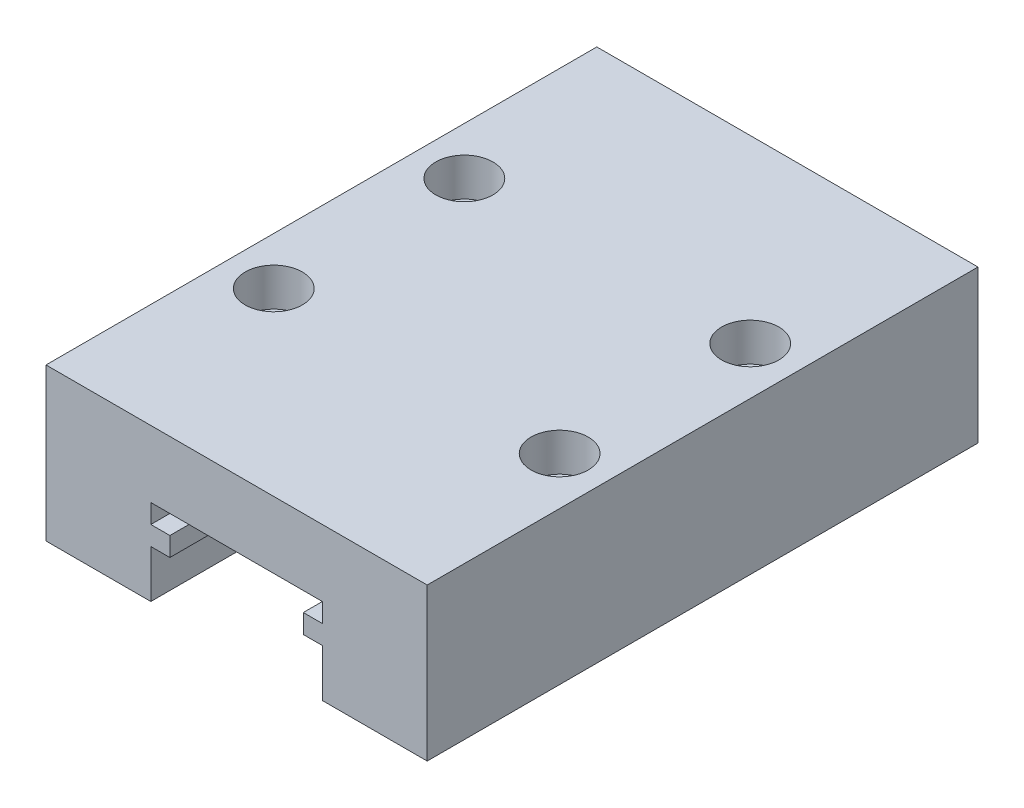
ISO-10303-21;
HEADER;
FILE_DESCRIPTION(('STEP AP214'),'2;1');
FILE_NAME('part.step','',(''),(''),'','','');
FILE_SCHEMA(('AUTOMOTIVE_DESIGN { 1 0 10303 214 1 1 1 1 }'));
ENDSEC;
DATA;
#1=APPLICATION_CONTEXT('core data for automotive mechanical design processes');
#2=APPLICATION_PROTOCOL_DEFINITION('international standard','automotive_design',2000,#1);
#3=PRODUCT_CONTEXT('',#1,'mechanical');
#4=PRODUCT('Part','Part','',(#3));
#5=PRODUCT_RELATED_PRODUCT_CATEGORY('part','',(#4));
#6=PRODUCT_DEFINITION_FORMATION('','',#4);
#7=PRODUCT_DEFINITION_CONTEXT('part definition',#1,'design');
#8=PRODUCT_DEFINITION('design','',#6,#7);
#9=PRODUCT_DEFINITION_SHAPE('','',#8);
#10=(LENGTH_UNIT() NAMED_UNIT(*) SI_UNIT(.MILLI.,.METRE.));
#11=(NAMED_UNIT(*) PLANE_ANGLE_UNIT() SI_UNIT($,.RADIAN.));
#12=(NAMED_UNIT(*) SI_UNIT($,.STERADIAN.) SOLID_ANGLE_UNIT());
#13=UNCERTAINTY_MEASURE_WITH_UNIT(LENGTH_MEASURE(1.E-05),#10,'distance_accuracy_value','');
#14=(GEOMETRIC_REPRESENTATION_CONTEXT(3) GLOBAL_UNCERTAINTY_ASSIGNED_CONTEXT((#13)) GLOBAL_UNIT_ASSIGNED_CONTEXT((#10,
#11,#12)) REPRESENTATION_CONTEXT('',''));
#15=CARTESIAN_POINT('',(0.,0.,0.));
#16=DIRECTION('',(0.,0.,1.));
#17=DIRECTION('',(1.,0.,0.));
#18=AXIS2_PLACEMENT_3D('',#15,#16,#17);
#19=CARTESIAN_POINT('',(-10.,8.,28.9));
#20=DIRECTION('',(1.,0.,0.));
#21=DIRECTION('',(0.,1.,0.));
#22=AXIS2_PLACEMENT_3D('',#19,#20,#21);
#23=PLANE('',#22);
#24=DIRECTION('',(0.,-1.,0.));
#25=VECTOR('',#24,1.);
#26=CARTESIAN_POINT('',(-10.,8.,0.));
#27=LINE('',#26,#25);
#28=CARTESIAN_POINT('',(-10.,8.,0.));
#29=VERTEX_POINT('',#28);
#30=CARTESIAN_POINT('',(-10.,0.,0.));
#31=VERTEX_POINT('',#30);
#32=EDGE_CURVE('E179',#29,#31,#27,.T.);
#33=ORIENTED_EDGE('',*,*,#32,.T.);
#34=DIRECTION('',(0.,0.,-1.));
#35=VECTOR('',#34,1.);
#36=CARTESIAN_POINT('',(-10.,0.,28.9));
#37=LINE('',#36,#35);
#38=CARTESIAN_POINT('',(-10.,0.,28.9));
#39=VERTEX_POINT('',#38);
#40=EDGE_CURVE('E11',#39,#31,#37,.T.);
#41=ORIENTED_EDGE('',*,*,#40,.F.);
#42=DIRECTION('',(0.,-1.,0.));
#43=VECTOR('',#42,1.);
#44=CARTESIAN_POINT('',(-10.,8.,28.9));
#45=LINE('',#44,#43);
#46=CARTESIAN_POINT('',(-10.,8.,28.9));
#47=VERTEX_POINT('',#46);
#48=EDGE_CURVE('E210',#47,#39,#45,.T.);
#49=ORIENTED_EDGE('',*,*,#48,.F.);
#50=DIRECTION('',(0.,0.,-1.));
#51=VECTOR('',#50,1.);
#52=CARTESIAN_POINT('',(-10.,8.,28.9));
#53=LINE('',#52,#51);
#54=EDGE_CURVE('E175',#47,#29,#53,.T.);
#55=ORIENTED_EDGE('',*,*,#54,.T.);
#56=EDGE_LOOP('',(#33,#41,#49,#55));
#57=FACE_BOUND('',#56,.T.);
#58=ADVANCED_FACE('F35',(#57),#23,.F.);
#59=CARTESIAN_POINT('',(-10.,0.,28.9));
#60=DIRECTION('',(0.,1.,0.));
#61=DIRECTION('',(0.,0.,1.));
#62=AXIS2_PLACEMENT_3D('',#59,#60,#61);
#63=PLANE('',#62);
#64=DIRECTION('',(1.,0.,0.));
#65=VECTOR('',#64,1.);
#66=CARTESIAN_POINT('',(-10.,0.,0.));
#67=LINE('',#66,#65);
#68=CARTESIAN_POINT('',(-4.5,0.,0.));
#69=VERTEX_POINT('',#68);
#70=EDGE_CURVE('E182',#31,#69,#67,.T.);
#71=ORIENTED_EDGE('',*,*,#70,.T.);
#72=DIRECTION('',(0.,0.,-1.));
#73=VECTOR('',#72,1.);
#74=CARTESIAN_POINT('',(-4.5,0.,28.9));
#75=LINE('',#74,#73);
#76=CARTESIAN_POINT('',(-4.5,0.,28.9));
#77=VERTEX_POINT('',#76);
#78=EDGE_CURVE('E43',#77,#69,#75,.T.);
#79=ORIENTED_EDGE('',*,*,#78,.F.);
#80=DIRECTION('',(1.,0.,0.));
#81=VECTOR('',#80,1.);
#82=CARTESIAN_POINT('',(-10.,0.,28.9));
#83=LINE('',#82,#81);
#84=EDGE_CURVE('E118',#39,#77,#83,.T.);
#85=ORIENTED_EDGE('',*,*,#84,.F.);
#86=ORIENTED_EDGE('',*,*,#40,.T.);
#87=EDGE_LOOP('',(#71,#79,#85,#86));
#88=FACE_BOUND('',#87,.T.);
#89=ADVANCED_FACE('F311',(#88),#63,.F.);
#90=CARTESIAN_POINT('',(-4.5,2.5,28.9));
#91=DIRECTION('',(-1.,0.,0.));
#92=DIRECTION('',(0.,0.,1.));
#93=AXIS2_PLACEMENT_3D('',#90,#91,#92);
#94=PLANE('',#93);
#95=DIRECTION('',(0.,1.,0.));
#96=VECTOR('',#95,1.);
#97=CARTESIAN_POINT('',(-4.5,2.5,0.));
#98=LINE('',#97,#96);
#99=CARTESIAN_POINT('',(-4.5,2.5,0.));
#100=VERTEX_POINT('',#99);
#101=EDGE_CURVE('E185',#69,#100,#98,.T.);
#102=ORIENTED_EDGE('',*,*,#101,.T.);
#103=DIRECTION('',(0.,0.,-1.));
#104=VECTOR('',#103,1.);
#105=CARTESIAN_POINT('',(-4.5,2.5,28.9));
#106=LINE('',#105,#104);
#107=CARTESIAN_POINT('',(-4.5,2.5,28.9));
#108=VERTEX_POINT('',#107);
#109=EDGE_CURVE('E241',#108,#100,#106,.T.);
#110=ORIENTED_EDGE('',*,*,#109,.F.);
#111=DIRECTION('',(0.,1.,0.));
#112=VECTOR('',#111,1.);
#113=CARTESIAN_POINT('',(-4.5,2.5,28.9));
#114=LINE('',#113,#112);
#115=EDGE_CURVE('E249',#77,#108,#114,.T.);
#116=ORIENTED_EDGE('',*,*,#115,.F.);
#117=ORIENTED_EDGE('',*,*,#78,.T.);
#118=EDGE_LOOP('',(#102,#110,#116,#117));
#119=FACE_BOUND('',#118,.T.);
#120=ADVANCED_FACE('F247',(#119),#94,.F.);
#121=CARTESIAN_POINT('',(-3.5,2.5,28.9));
#122=DIRECTION('',(0.,1.,0.));
#123=DIRECTION('',(-1.,0.,0.));
#124=AXIS2_PLACEMENT_3D('',#121,#122,#123);
#125=PLANE('',#124);
#126=DIRECTION('',(1.,0.,0.));
#127=VECTOR('',#126,1.);
#128=CARTESIAN_POINT('',(-3.5,2.5,0.));
#129=LINE('',#128,#127);
#130=CARTESIAN_POINT('',(-3.5,2.5,0.));
#131=VERTEX_POINT('',#130);
#132=EDGE_CURVE('E187',#100,#131,#129,.T.);
#133=ORIENTED_EDGE('',*,*,#132,.T.);
#134=DIRECTION('',(0.,0.,-1.));
#135=VECTOR('',#134,1.);
#136=CARTESIAN_POINT('',(-3.5,2.5,28.9));
#137=LINE('',#136,#135);
#138=CARTESIAN_POINT('',(-3.5,2.5,28.9));
#139=VERTEX_POINT('',#138);
#140=EDGE_CURVE('E238',#139,#131,#137,.T.);
#141=ORIENTED_EDGE('',*,*,#140,.F.);
#142=DIRECTION('',(1.,0.,0.));
#143=VECTOR('',#142,1.);
#144=CARTESIAN_POINT('',(-3.5,2.5,28.9));
#145=LINE('',#144,#143);
#146=EDGE_CURVE('E267',#108,#139,#145,.T.);
#147=ORIENTED_EDGE('',*,*,#146,.F.);
#148=ORIENTED_EDGE('',*,*,#109,.T.);
#149=EDGE_LOOP('',(#133,#141,#147,#148));
#150=FACE_BOUND('',#149,.T.);
#151=ADVANCED_FACE('F258',(#150),#125,.F.);
#152=CARTESIAN_POINT('',(-3.5,3.5,28.9));
#153=DIRECTION('',(-1.,0.,0.));
#154=DIRECTION('',(0.,-1.,0.));
#155=AXIS2_PLACEMENT_3D('',#152,#153,#154);
#156=PLANE('',#155);
#157=DIRECTION('',(0.,1.,0.));
#158=VECTOR('',#157,1.);
#159=CARTESIAN_POINT('',(-3.5,3.5,0.));
#160=LINE('',#159,#158);
#161=CARTESIAN_POINT('',(-3.5,3.5,0.));
#162=VERTEX_POINT('',#161);
#163=EDGE_CURVE('E189',#131,#162,#160,.T.);
#164=ORIENTED_EDGE('',*,*,#163,.T.);
#165=DIRECTION('',(0.,0.,-1.));
#166=VECTOR('',#165,1.);
#167=CARTESIAN_POINT('',(-3.5,3.5,28.9));
#168=LINE('',#167,#166);
#169=CARTESIAN_POINT('',(-3.5,3.5,28.9));
#170=VERTEX_POINT('',#169);
#171=EDGE_CURVE('E235',#170,#162,#168,.T.);
#172=ORIENTED_EDGE('',*,*,#171,.F.);
#173=DIRECTION('',(0.,1.,0.));
#174=VECTOR('',#173,1.);
#175=CARTESIAN_POINT('',(-3.5,3.5,28.9));
#176=LINE('',#175,#174);
#177=EDGE_CURVE('E264',#139,#170,#176,.T.);
#178=ORIENTED_EDGE('',*,*,#177,.F.);
#179=ORIENTED_EDGE('',*,*,#140,.T.);
#180=EDGE_LOOP('',(#164,#172,#178,#179));
#181=FACE_BOUND('',#180,.T.);
#182=ADVANCED_FACE('F262',(#181),#156,.F.);
#183=CARTESIAN_POINT('',(-4.5,3.5,28.9));
#184=DIRECTION('',(0.,-1.,0.));
#185=DIRECTION('',(0.,0.,-1.));
#186=AXIS2_PLACEMENT_3D('',#183,#184,#185);
#187=PLANE('',#186);
#188=DIRECTION('',(-1.,0.,0.));
#189=VECTOR('',#188,1.);
#190=CARTESIAN_POINT('',(-4.5,3.5,0.));
#191=LINE('',#190,#189);
#192=CARTESIAN_POINT('',(-4.5,3.5,0.));
#193=VERTEX_POINT('',#192);
#194=EDGE_CURVE('E191',#162,#193,#191,.T.);
#195=ORIENTED_EDGE('',*,*,#194,.T.);
#196=DIRECTION('',(0.,0.,-1.));
#197=VECTOR('',#196,1.);
#198=CARTESIAN_POINT('',(-4.5,3.5,28.9));
#199=LINE('',#198,#197);
#200=CARTESIAN_POINT('',(-4.5,3.5,28.9));
#201=VERTEX_POINT('',#200);
#202=EDGE_CURVE('E232',#201,#193,#199,.T.);
#203=ORIENTED_EDGE('',*,*,#202,.F.);
#204=DIRECTION('',(-1.,0.,0.));
#205=VECTOR('',#204,1.);
#206=CARTESIAN_POINT('',(-4.5,3.5,28.9));
#207=LINE('',#206,#205);
#208=EDGE_CURVE('E266',#170,#201,#207,.T.);
#209=ORIENTED_EDGE('',*,*,#208,.F.);
#210=ORIENTED_EDGE('',*,*,#171,.T.);
#211=EDGE_LOOP('',(#195,#203,#209,#210));
#212=FACE_BOUND('',#211,.T.);
#213=ADVANCED_FACE('F324',(#212),#187,.F.);
#214=CARTESIAN_POINT('',(-4.5,4.5,28.9));
#215=DIRECTION('',(-1.,0.,0.));
#216=DIRECTION('',(0.,0.,1.));
#217=AXIS2_PLACEMENT_3D('',#214,#215,#216);
#218=PLANE('',#217);
#219=DIRECTION('',(0.,1.,0.));
#220=VECTOR('',#219,1.);
#221=CARTESIAN_POINT('',(-4.5,4.5,0.));
#222=LINE('',#221,#220);
#223=CARTESIAN_POINT('',(-4.5,4.5,0.));
#224=VERTEX_POINT('',#223);
#225=EDGE_CURVE('E193',#193,#224,#222,.T.);
#226=ORIENTED_EDGE('',*,*,#225,.T.);
#227=DIRECTION('',(0.,0.,-1.));
#228=VECTOR('',#227,1.);
#229=CARTESIAN_POINT('',(-4.5,4.5,28.9));
#230=LINE('',#229,#228);
#231=CARTESIAN_POINT('',(-4.5,4.5,28.9));
#232=VERTEX_POINT('',#231);
#233=EDGE_CURVE('E229',#232,#224,#230,.T.);
#234=ORIENTED_EDGE('',*,*,#233,.F.);
#235=DIRECTION('',(0.,1.,0.));
#236=VECTOR('',#235,1.);
#237=CARTESIAN_POINT('',(-4.5,4.5,28.9));
#238=LINE('',#237,#236);
#239=EDGE_CURVE('E269',#201,#232,#238,.T.);
#240=ORIENTED_EDGE('',*,*,#239,.F.);
#241=ORIENTED_EDGE('',*,*,#202,.T.);
#242=EDGE_LOOP('',(#226,#234,#240,#241));
#243=FACE_BOUND('',#242,.T.);
#244=ADVANCED_FACE('F327',(#243),#218,.F.);
#245=CARTESIAN_POINT('',(-4.5,4.5,28.9));
#246=DIRECTION('',(0.,1.,0.));
#247=DIRECTION('',(0.,0.,1.));
#248=AXIS2_PLACEMENT_3D('',#245,#246,#247);
#249=PLANE('',#248);
#250=DIRECTION('',(1.,0.,0.));
#251=VECTOR('',#250,1.);
#252=CARTESIAN_POINT('',(-4.5,4.5,0.));
#253=LINE('',#252,#251);
#254=CARTESIAN_POINT('',(4.5,4.5,0.));
#255=VERTEX_POINT('',#254);
#256=EDGE_CURVE('E195',#224,#255,#253,.T.);
#257=ORIENTED_EDGE('',*,*,#256,.T.);
#258=DIRECTION('',(0.,0.,-1.));
#259=VECTOR('',#258,1.);
#260=CARTESIAN_POINT('',(4.5,4.5,28.9));
#261=LINE('',#260,#259);
#262=CARTESIAN_POINT('',(4.5,4.5,28.9));
#263=VERTEX_POINT('',#262);
#264=EDGE_CURVE('E226',#263,#255,#261,.T.);
#265=ORIENTED_EDGE('',*,*,#264,.F.);
#266=DIRECTION('',(1.,0.,0.));
#267=VECTOR('',#266,1.);
#268=CARTESIAN_POINT('',(-4.5,4.5,28.9));
#269=LINE('',#268,#267);
#270=EDGE_CURVE('E275',#232,#263,#269,.T.);
#271=ORIENTED_EDGE('',*,*,#270,.F.);
#272=ORIENTED_EDGE('',*,*,#233,.T.);
#273=EDGE_LOOP('',(#257,#265,#271,#272));
#274=FACE_BOUND('',#273,.T.);
#275=ADVANCED_FACE('F331',(#274),#249,.F.);
#276=CARTESIAN_POINT('',(4.5,3.5,28.9));
#277=DIRECTION('',(1.,0.,0.));
#278=DIRECTION('',(0.,1.,0.));
#279=AXIS2_PLACEMENT_3D('',#276,#277,#278);
#280=PLANE('',#279);
#281=DIRECTION('',(0.,-1.,0.));
#282=VECTOR('',#281,1.);
#283=CARTESIAN_POINT('',(4.5,3.5,0.));
#284=LINE('',#283,#282);
#285=CARTESIAN_POINT('',(4.5,3.5,0.));
#286=VERTEX_POINT('',#285);
#287=EDGE_CURVE('E197',#255,#286,#284,.T.);
#288=ORIENTED_EDGE('',*,*,#287,.T.);
#289=DIRECTION('',(0.,0.,-1.));
#290=VECTOR('',#289,1.);
#291=CARTESIAN_POINT('',(4.5,3.5,28.9));
#292=LINE('',#291,#290);
#293=CARTESIAN_POINT('',(4.5,3.5,28.9));
#294=VERTEX_POINT('',#293);
#295=EDGE_CURVE('E223',#294,#286,#292,.T.);
#296=ORIENTED_EDGE('',*,*,#295,.F.);
#297=DIRECTION('',(0.,-1.,0.));
#298=VECTOR('',#297,1.);
#299=CARTESIAN_POINT('',(4.5,3.5,28.9));
#300=LINE('',#299,#298);
#301=EDGE_CURVE('E277',#263,#294,#300,.T.);
#302=ORIENTED_EDGE('',*,*,#301,.F.);
#303=ORIENTED_EDGE('',*,*,#264,.T.);
#304=EDGE_LOOP('',(#288,#296,#302,#303));
#305=FACE_BOUND('',#304,.T.);
#306=ADVANCED_FACE('F335',(#305),#280,.F.);
#307=CARTESIAN_POINT('',(4.5,3.5,28.9));
#308=DIRECTION('',(0.,-1.,0.));
#309=DIRECTION('',(1.,0.,0.));
#310=AXIS2_PLACEMENT_3D('',#307,#308,#309);
#311=PLANE('',#310);
#312=DIRECTION('',(-1.,0.,0.));
#313=VECTOR('',#312,1.);
#314=CARTESIAN_POINT('',(4.5,3.5,0.));
#315=LINE('',#314,#313);
#316=CARTESIAN_POINT('',(3.5,3.5,0.));
#317=VERTEX_POINT('',#316);
#318=EDGE_CURVE('E199',#286,#317,#315,.T.);
#319=ORIENTED_EDGE('',*,*,#318,.T.);
#320=DIRECTION('',(0.,0.,-1.));
#321=VECTOR('',#320,1.);
#322=CARTESIAN_POINT('',(3.5,3.5,28.9));
#323=LINE('',#322,#321);
#324=CARTESIAN_POINT('',(3.5,3.5,28.9));
#325=VERTEX_POINT('',#324);
#326=EDGE_CURVE('E220',#325,#317,#323,.T.);
#327=ORIENTED_EDGE('',*,*,#326,.F.);
#328=DIRECTION('',(-1.,0.,0.));
#329=VECTOR('',#328,1.);
#330=CARTESIAN_POINT('',(4.5,3.5,28.9));
#331=LINE('',#330,#329);
#332=EDGE_CURVE('E279',#294,#325,#331,.T.);
#333=ORIENTED_EDGE('',*,*,#332,.F.);
#334=ORIENTED_EDGE('',*,*,#295,.T.);
#335=EDGE_LOOP('',(#319,#327,#333,#334));
#336=FACE_BOUND('',#335,.T.);
#337=ADVANCED_FACE('F339',(#336),#311,.F.);
#338=CARTESIAN_POINT('',(3.5,3.5,28.9));
#339=DIRECTION('',(1.,0.,0.));
#340=DIRECTION('',(0.,0.,-1.));
#341=AXIS2_PLACEMENT_3D('',#338,#339,#340);
#342=PLANE('',#341);
#343=DIRECTION('',(0.,-1.,0.));
#344=VECTOR('',#343,1.);
#345=CARTESIAN_POINT('',(3.5,3.5,0.));
#346=LINE('',#345,#344);
#347=CARTESIAN_POINT('',(3.5,2.5,0.));
#348=VERTEX_POINT('',#347);
#349=EDGE_CURVE('E201',#317,#348,#346,.T.);
#350=ORIENTED_EDGE('',*,*,#349,.T.);
#351=DIRECTION('',(0.,0.,-1.));
#352=VECTOR('',#351,1.);
#353=CARTESIAN_POINT('',(3.5,2.5,28.9));
#354=LINE('',#353,#352);
#355=CARTESIAN_POINT('',(3.5,2.5,28.9));
#356=VERTEX_POINT('',#355);
#357=EDGE_CURVE('E217',#356,#348,#354,.T.);
#358=ORIENTED_EDGE('',*,*,#357,.F.);
#359=DIRECTION('',(0.,-1.,0.));
#360=VECTOR('',#359,1.);
#361=CARTESIAN_POINT('',(3.5,3.5,28.9));
#362=LINE('',#361,#360);
#363=EDGE_CURVE('E281',#325,#356,#362,.T.);
#364=ORIENTED_EDGE('',*,*,#363,.F.);
#365=ORIENTED_EDGE('',*,*,#326,.T.);
#366=EDGE_LOOP('',(#350,#358,#364,#365));
#367=FACE_BOUND('',#366,.T.);
#368=ADVANCED_FACE('F343',(#367),#342,.F.);
#369=CARTESIAN_POINT('',(3.5,2.5,28.9));
#370=DIRECTION('',(0.,1.,0.));
#371=DIRECTION('',(0.,0.,1.));
#372=AXIS2_PLACEMENT_3D('',#369,#370,#371);
#373=PLANE('',#372);
#374=DIRECTION('',(1.,0.,0.));
#375=VECTOR('',#374,1.);
#376=CARTESIAN_POINT('',(3.5,2.5,0.));
#377=LINE('',#376,#375);
#378=CARTESIAN_POINT('',(4.5,2.5,0.));
#379=VERTEX_POINT('',#378);
#380=EDGE_CURVE('E203',#348,#379,#377,.T.);
#381=ORIENTED_EDGE('',*,*,#380,.T.);
#382=DIRECTION('',(0.,0.,-1.));
#383=VECTOR('',#382,1.);
#384=CARTESIAN_POINT('',(4.5,2.5,28.9));
#385=LINE('',#384,#383);
#386=CARTESIAN_POINT('',(4.5,2.5,28.9));
#387=VERTEX_POINT('',#386);
#388=EDGE_CURVE('E214',#387,#379,#385,.T.);
#389=ORIENTED_EDGE('',*,*,#388,.F.);
#390=DIRECTION('',(1.,0.,0.));
#391=VECTOR('',#390,1.);
#392=CARTESIAN_POINT('',(3.5,2.5,28.9));
#393=LINE('',#392,#391);
#394=EDGE_CURVE('E283',#356,#387,#393,.T.);
#395=ORIENTED_EDGE('',*,*,#394,.F.);
#396=ORIENTED_EDGE('',*,*,#357,.T.);
#397=EDGE_LOOP('',(#381,#389,#395,#396));
#398=FACE_BOUND('',#397,.T.);
#399=ADVANCED_FACE('F289',(#398),#373,.F.);
#400=CARTESIAN_POINT('',(4.5,2.5,28.9));
#401=DIRECTION('',(1.,0.,0.));
#402=DIRECTION('',(0.,0.,-1.));
#403=AXIS2_PLACEMENT_3D('',#400,#401,#402);
#404=PLANE('',#403);
#405=DIRECTION('',(0.,-1.,0.));
#406=VECTOR('',#405,1.);
#407=CARTESIAN_POINT('',(4.5,2.5,0.));
#408=LINE('',#407,#406);
#409=CARTESIAN_POINT('',(4.5,0.,0.));
#410=VERTEX_POINT('',#409);
#411=EDGE_CURVE('E205',#379,#410,#408,.T.);
#412=ORIENTED_EDGE('',*,*,#411,.T.);
#413=DIRECTION('',(0.,0.,-1.));
#414=VECTOR('',#413,1.);
#415=CARTESIAN_POINT('',(4.5,0.,28.9));
#416=LINE('',#415,#414);
#417=CARTESIAN_POINT('',(4.5,0.,28.9));
#418=VERTEX_POINT('',#417);
#419=EDGE_CURVE('E170',#418,#410,#416,.T.);
#420=ORIENTED_EDGE('',*,*,#419,.F.);
#421=DIRECTION('',(0.,-1.,0.));
#422=VECTOR('',#421,1.);
#423=CARTESIAN_POINT('',(4.5,2.5,28.9));
#424=LINE('',#423,#422);
#425=EDGE_CURVE('E161',#387,#418,#424,.T.);
#426=ORIENTED_EDGE('',*,*,#425,.F.);
#427=ORIENTED_EDGE('',*,*,#388,.T.);
#428=EDGE_LOOP('',(#412,#420,#426,#427));
#429=FACE_BOUND('',#428,.T.);
#430=ADVANCED_FACE('F293',(#429),#404,.F.);
#431=CARTESIAN_POINT('',(10.,0.,28.9));
#432=DIRECTION('',(0.,1.,0.));
#433=DIRECTION('',(0.,0.,1.));
#434=AXIS2_PLACEMENT_3D('',#431,#432,#433);
#435=PLANE('',#434);
#436=DIRECTION('',(1.,0.,0.));
#437=VECTOR('',#436,1.);
#438=CARTESIAN_POINT('',(10.,0.,0.));
#439=LINE('',#438,#437);
#440=CARTESIAN_POINT('',(10.,0.,0.));
#441=VERTEX_POINT('',#440);
#442=EDGE_CURVE('E169',#410,#441,#439,.T.);
#443=ORIENTED_EDGE('',*,*,#442,.T.);
#444=DIRECTION('',(0.,0.,-1.));
#445=VECTOR('',#444,1.);
#446=CARTESIAN_POINT('',(10.,0.,28.9));
#447=LINE('',#446,#445);
#448=CARTESIAN_POINT('',(10.,0.,28.9));
#449=VERTEX_POINT('',#448);
#450=EDGE_CURVE('E166',#449,#441,#447,.T.);
#451=ORIENTED_EDGE('',*,*,#450,.F.);
#452=DIRECTION('',(1.,0.,0.));
#453=VECTOR('',#452,1.);
#454=CARTESIAN_POINT('',(10.,0.,28.9));
#455=LINE('',#454,#453);
#456=EDGE_CURVE('E155',#418,#449,#455,.T.);
#457=ORIENTED_EDGE('',*,*,#456,.F.);
#458=ORIENTED_EDGE('',*,*,#419,.T.);
#459=EDGE_LOOP('',(#443,#451,#457,#458));
#460=FACE_BOUND('',#459,.T.);
#461=ADVANCED_FACE('F167',(#460),#435,.F.);
#462=CARTESIAN_POINT('',(10.,8.,28.9));
#463=DIRECTION('',(-1.,0.,0.));
#464=DIRECTION('',(0.,-1.,0.));
#465=AXIS2_PLACEMENT_3D('',#462,#463,#464);
#466=PLANE('',#465);
#467=DIRECTION('',(0.,1.,0.));
#468=VECTOR('',#467,1.);
#469=CARTESIAN_POINT('',(10.,8.,0.));
#470=LINE('',#469,#468);
#471=CARTESIAN_POINT('',(10.,8.,0.));
#472=VERTEX_POINT('',#471);
#473=EDGE_CURVE('E104',#441,#472,#470,.T.);
#474=ORIENTED_EDGE('',*,*,#473,.T.);
#475=DIRECTION('',(0.,0.,-1.));
#476=VECTOR('',#475,1.);
#477=CARTESIAN_POINT('',(10.,8.,28.9));
#478=LINE('',#477,#476);
#479=CARTESIAN_POINT('',(10.,8.,28.9));
#480=VERTEX_POINT('',#479);
#481=EDGE_CURVE('E171',#480,#472,#478,.T.);
#482=ORIENTED_EDGE('',*,*,#481,.F.);
#483=DIRECTION('',(0.,1.,0.));
#484=VECTOR('',#483,1.);
#485=CARTESIAN_POINT('',(10.,8.,28.9));
#486=LINE('',#485,#484);
#487=EDGE_CURVE('E159',#449,#480,#486,.T.);
#488=ORIENTED_EDGE('',*,*,#487,.F.);
#489=ORIENTED_EDGE('',*,*,#450,.T.);
#490=EDGE_LOOP('',(#474,#482,#488,#489));
#491=FACE_BOUND('',#490,.T.);
#492=ADVANCED_FACE('F173',(#491),#466,.F.);
#493=CARTESIAN_POINT('',(10.,8.,28.9));
#494=DIRECTION('',(0.,-1.,0.));
#495=DIRECTION('',(1.,0.,0.));
#496=AXIS2_PLACEMENT_3D('',#493,#494,#495);
#497=PLANE('',#496);
#498=CARTESIAN_POINT('',(7.5,8.,9.45));
#499=DIRECTION('',(0.,1.,0.));
#500=DIRECTION('',(0.,0.,-1.));
#501=AXIS2_PLACEMENT_3D('',#498,#499,#500);
#502=CIRCLE('',#501,1.5);
#503=CARTESIAN_POINT('',(7.5,8.,7.95));
#504=VERTEX_POINT('',#503);
#505=EDGE_CURVE('E466',#504,#504,#502,.T.);
#506=ORIENTED_EDGE('',*,*,#505,.F.);
#507=EDGE_LOOP('',(#506));
#508=FACE_BOUND('',#507,.T.);
#509=CARTESIAN_POINT('',(7.5,8.,19.45));
#510=DIRECTION('',(0.,1.,0.));
#511=DIRECTION('',(0.,0.,-1.));
#512=AXIS2_PLACEMENT_3D('',#509,#510,#511);
#513=CIRCLE('',#512,1.5);
#514=CARTESIAN_POINT('',(7.5,8.,17.95));
#515=VERTEX_POINT('',#514);
#516=EDGE_CURVE('E465',#515,#515,#513,.T.);
#517=ORIENTED_EDGE('',*,*,#516,.F.);
#518=EDGE_LOOP('',(#517));
#519=FACE_BOUND('',#518,.T.);
#520=CARTESIAN_POINT('',(-7.5,8.,19.45));
#521=DIRECTION('',(0.,1.,0.));
#522=DIRECTION('',(0.,0.,1.));
#523=AXIS2_PLACEMENT_3D('',#520,#521,#522);
#524=CIRCLE('',#523,1.5);
#525=CARTESIAN_POINT('',(-7.5,8.,20.95));
#526=VERTEX_POINT('',#525);
#527=EDGE_CURVE('E485',#526,#526,#524,.T.);
#528=ORIENTED_EDGE('',*,*,#527,.F.);
#529=EDGE_LOOP('',(#528));
#530=FACE_BOUND('',#529,.T.);
#531=CARTESIAN_POINT('',(-7.5,8.,9.45));
#532=DIRECTION('',(0.,1.,0.));
#533=DIRECTION('',(0.,0.,1.));
#534=AXIS2_PLACEMENT_3D('',#531,#532,#533);
#535=CIRCLE('',#534,1.5);
#536=CARTESIAN_POINT('',(-7.5,8.,10.95));
#537=VERTEX_POINT('',#536);
#538=EDGE_CURVE('E477',#537,#537,#535,.T.);
#539=ORIENTED_EDGE('',*,*,#538,.F.);
#540=EDGE_LOOP('',(#539));
#541=FACE_BOUND('',#540,.T.);
#542=DIRECTION('',(-1.,0.,0.));
#543=VECTOR('',#542,1.);
#544=CARTESIAN_POINT('',(10.,8.,0.));
#545=LINE('',#544,#543);
#546=EDGE_CURVE('E110',#472,#29,#545,.T.);
#547=ORIENTED_EDGE('',*,*,#546,.T.);
#548=ORIENTED_EDGE('',*,*,#54,.F.);
#549=DIRECTION('',(-1.,0.,0.));
#550=VECTOR('',#549,1.);
#551=CARTESIAN_POINT('',(10.,8.,28.9));
#552=LINE('',#551,#550);
#553=EDGE_CURVE('E51',#480,#47,#552,.T.);
#554=ORIENTED_EDGE('',*,*,#553,.F.);
#555=ORIENTED_EDGE('',*,*,#481,.T.);
#556=EDGE_LOOP('',(#547,#548,#554,#555));
#557=FACE_BOUND('',#556,.T.);
#558=ADVANCED_FACE('F297',(#508,#519,#530,#541,#557),#497,.F.);
#559=CARTESIAN_POINT('',(0.,0.,28.9));
#560=DIRECTION('',(0.,0.,1.));
#561=DIRECTION('',(1.,0.,0.));
#562=AXIS2_PLACEMENT_3D('',#559,#560,#561);
#563=PLANE('',#562);
#564=ORIENTED_EDGE('',*,*,#48,.T.);
#565=ORIENTED_EDGE('',*,*,#84,.T.);
#566=ORIENTED_EDGE('',*,*,#115,.T.);
#567=ORIENTED_EDGE('',*,*,#146,.T.);
#568=ORIENTED_EDGE('',*,*,#177,.T.);
#569=ORIENTED_EDGE('',*,*,#208,.T.);
#570=ORIENTED_EDGE('',*,*,#239,.T.);
#571=ORIENTED_EDGE('',*,*,#270,.T.);
#572=ORIENTED_EDGE('',*,*,#301,.T.);
#573=ORIENTED_EDGE('',*,*,#332,.T.);
#574=ORIENTED_EDGE('',*,*,#363,.T.);
#575=ORIENTED_EDGE('',*,*,#394,.T.);
#576=ORIENTED_EDGE('',*,*,#425,.T.);
#577=ORIENTED_EDGE('',*,*,#456,.T.);
#578=ORIENTED_EDGE('',*,*,#487,.T.);
#579=ORIENTED_EDGE('',*,*,#553,.T.);
#580=EDGE_LOOP('',(#564,#565,#566,#567,#568,#569,#570,#571,#572,#573,#574,#575,#576,#577,#578,#579));
#581=FACE_BOUND('',#580,.T.);
#582=ADVANCED_FACE('F157',(#581),#563,.T.);
#583=CARTESIAN_POINT('',(0.,0.,0.));
#584=DIRECTION('',(0.,0.,1.));
#585=DIRECTION('',(1.,0.,0.));
#586=AXIS2_PLACEMENT_3D('',#583,#584,#585);
#587=PLANE('',#586);
#588=ORIENTED_EDGE('',*,*,#32,.F.);
#589=ORIENTED_EDGE('',*,*,#546,.F.);
#590=ORIENTED_EDGE('',*,*,#473,.F.);
#591=ORIENTED_EDGE('',*,*,#442,.F.);
#592=ORIENTED_EDGE('',*,*,#411,.F.);
#593=ORIENTED_EDGE('',*,*,#380,.F.);
#594=ORIENTED_EDGE('',*,*,#349,.F.);
#595=ORIENTED_EDGE('',*,*,#318,.F.);
#596=ORIENTED_EDGE('',*,*,#287,.F.);
#597=ORIENTED_EDGE('',*,*,#256,.F.);
#598=ORIENTED_EDGE('',*,*,#225,.F.);
#599=ORIENTED_EDGE('',*,*,#194,.F.);
#600=ORIENTED_EDGE('',*,*,#163,.F.);
#601=ORIENTED_EDGE('',*,*,#132,.F.);
#602=ORIENTED_EDGE('',*,*,#101,.F.);
#603=ORIENTED_EDGE('',*,*,#70,.F.);
#604=EDGE_LOOP('',(#588,#589,#590,#591,#592,#593,#594,#595,#596,#597,#598,#599,#600,#601,#602,#603));
#605=FACE_BOUND('',#604,.T.);
#606=ADVANCED_FACE('F253',(#605),#587,.F.);
#607=CARTESIAN_POINT('',(-7.5,6.,9.45));
#608=DIRECTION('',(0.,1.,0.));
#609=DIRECTION('',(0.,0.,1.));
#610=AXIS2_PLACEMENT_3D('',#607,#608,#609);
#611=CYLINDRICAL_SURFACE('',#610,1.5);
#612=CARTESIAN_POINT('',(-7.5,6.,9.45));
#613=DIRECTION('',(0.,1.,0.));
#614=DIRECTION('',(0.,0.,1.));
#615=AXIS2_PLACEMENT_3D('',#612,#613,#614);
#616=CIRCLE('',#615,1.5);
#617=CARTESIAN_POINT('',(-7.5,6.,10.95));
#618=VERTEX_POINT('',#617);
#619=EDGE_CURVE('E183',#618,#618,#616,.T.);
#620=ORIENTED_EDGE('',*,*,#619,.F.);
#621=EDGE_LOOP('',(#620));
#622=FACE_BOUND('',#621,.T.);
#623=ORIENTED_EDGE('',*,*,#538,.T.);
#624=EDGE_LOOP('',(#623));
#625=FACE_BOUND('',#624,.T.);
#626=ADVANCED_FACE('F376',(#622,#625),#611,.F.);
#627=CARTESIAN_POINT('',(-7.5,6.,9.45));
#628=DIRECTION('',(0.,1.,0.));
#629=DIRECTION('',(0.,0.,1.));
#630=AXIS2_PLACEMENT_3D('',#627,#628,#629);
#631=PLANE('',#630);
#632=ORIENTED_EDGE('',*,*,#619,.T.);
#633=EDGE_LOOP('',(#632));
#634=FACE_BOUND('',#633,.T.);
#635=ADVANCED_FACE('F388',(#634),#631,.T.);
#636=CARTESIAN_POINT('',(-7.5,6.,19.45));
#637=DIRECTION('',(0.,1.,0.));
#638=DIRECTION('',(0.,0.,1.));
#639=AXIS2_PLACEMENT_3D('',#636,#637,#638);
#640=CYLINDRICAL_SURFACE('',#639,1.5);
#641=CARTESIAN_POINT('',(-7.5,6.,19.45));
#642=DIRECTION('',(0.,1.,0.));
#643=DIRECTION('',(0.,0.,1.));
#644=AXIS2_PLACEMENT_3D('',#641,#642,#643);
#645=CIRCLE('',#644,1.5);
#646=CARTESIAN_POINT('',(-7.5,6.,20.95));
#647=VERTEX_POINT('',#646);
#648=EDGE_CURVE('E480',#647,#647,#645,.T.);
#649=ORIENTED_EDGE('',*,*,#648,.F.);
#650=EDGE_LOOP('',(#649));
#651=FACE_BOUND('',#650,.T.);
#652=ORIENTED_EDGE('',*,*,#527,.T.);
#653=EDGE_LOOP('',(#652));
#654=FACE_BOUND('',#653,.T.);
#655=ADVANCED_FACE('F398',(#651,#654),#640,.F.);
#656=CARTESIAN_POINT('',(-7.5,6.,19.45));
#657=DIRECTION('',(0.,1.,0.));
#658=DIRECTION('',(0.,0.,1.));
#659=AXIS2_PLACEMENT_3D('',#656,#657,#658);
#660=PLANE('',#659);
#661=ORIENTED_EDGE('',*,*,#648,.T.);
#662=EDGE_LOOP('',(#661));
#663=FACE_BOUND('',#662,.T.);
#664=ADVANCED_FACE('F408',(#663),#660,.T.);
#665=CARTESIAN_POINT('',(7.5,6.,19.45));
#666=DIRECTION('',(0.,1.,0.));
#667=DIRECTION('',(0.,0.,1.));
#668=AXIS2_PLACEMENT_3D('',#665,#666,#667);
#669=CYLINDRICAL_SURFACE('',#668,1.5);
#670=CARTESIAN_POINT('',(7.5,6.,19.45));
#671=DIRECTION('',(0.,1.,0.));
#672=DIRECTION('',(0.,0.,-1.));
#673=AXIS2_PLACEMENT_3D('',#670,#671,#672);
#674=CIRCLE('',#673,1.5);
#675=CARTESIAN_POINT('',(7.5,6.,17.95));
#676=VERTEX_POINT('',#675);
#677=EDGE_CURVE('E469',#676,#676,#674,.T.);
#678=ORIENTED_EDGE('',*,*,#677,.F.);
#679=EDGE_LOOP('',(#678));
#680=FACE_BOUND('',#679,.T.);
#681=ORIENTED_EDGE('',*,*,#516,.T.);
#682=EDGE_LOOP('',(#681));
#683=FACE_BOUND('',#682,.T.);
#684=ADVANCED_FACE('F418',(#680,#683),#669,.F.);
#685=CARTESIAN_POINT('',(7.5,6.,19.45));
#686=DIRECTION('',(0.,-1.,0.));
#687=DIRECTION('',(0.,0.,-1.));
#688=AXIS2_PLACEMENT_3D('',#685,#686,#687);
#689=PLANE('',#688);
#690=ORIENTED_EDGE('',*,*,#677,.T.);
#691=EDGE_LOOP('',(#690));
#692=FACE_BOUND('',#691,.T.);
#693=ADVANCED_FACE('F428',(#692),#689,.F.);
#694=CARTESIAN_POINT('',(7.5,6.,9.45));
#695=DIRECTION('',(0.,1.,0.));
#696=DIRECTION('',(0.,0.,1.));
#697=AXIS2_PLACEMENT_3D('',#694,#695,#696);
#698=CYLINDRICAL_SURFACE('',#697,1.5);
#699=CARTESIAN_POINT('',(7.5,6.,9.45));
#700=DIRECTION('',(0.,1.,0.));
#701=DIRECTION('',(0.,0.,-1.));
#702=AXIS2_PLACEMENT_3D('',#699,#700,#701);
#703=CIRCLE('',#702,1.5);
#704=CARTESIAN_POINT('',(7.5,6.,7.95));
#705=VERTEX_POINT('',#704);
#706=EDGE_CURVE('E464',#705,#705,#703,.T.);
#707=ORIENTED_EDGE('',*,*,#706,.F.);
#708=EDGE_LOOP('',(#707));
#709=FACE_BOUND('',#708,.T.);
#710=ORIENTED_EDGE('',*,*,#505,.T.);
#711=EDGE_LOOP('',(#710));
#712=FACE_BOUND('',#711,.T.);
#713=ADVANCED_FACE('F438',(#709,#712),#698,.F.);
#714=CARTESIAN_POINT('',(7.5,6.,9.45));
#715=DIRECTION('',(0.,-1.,0.));
#716=DIRECTION('',(0.,0.,-1.));
#717=AXIS2_PLACEMENT_3D('',#714,#715,#716);
#718=PLANE('',#717);
#719=ORIENTED_EDGE('',*,*,#706,.T.);
#720=EDGE_LOOP('',(#719));
#721=FACE_BOUND('',#720,.T.);
#722=ADVANCED_FACE('F448',(#721),#718,.F.);
#723=CLOSED_SHELL('',(#58,#89,#120,#151,#182,#213,#244,#275,#306,#337,#368,#399,#430,#461,#492,
#558,#582,#606,#626,#635,#655,#664,#684,#693,#713,#722));
#724=MANIFOLD_SOLID_BREP('B2',#723);
#725=ADVANCED_BREP_SHAPE_REPRESENTATION('',(#18,#724),#14);
#726=SHAPE_DEFINITION_REPRESENTATION(#9,#725);
ENDSEC;
END-ISO-10303-21;
